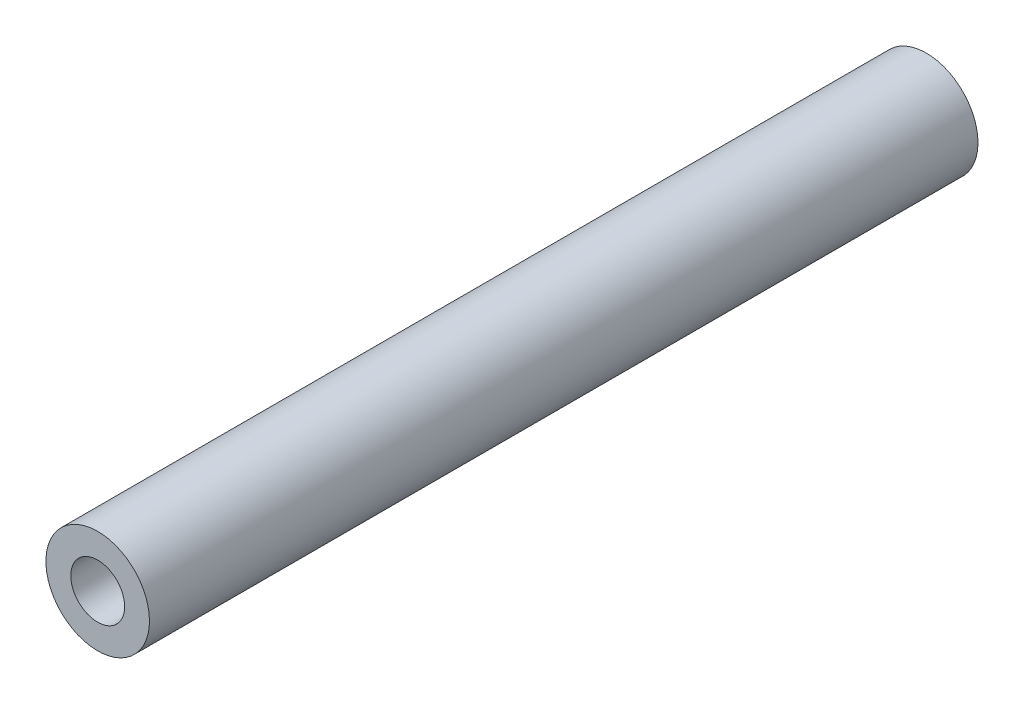
ISO-10303-21;
HEADER;
FILE_DESCRIPTION(('STEP AP214'),'2;1');
FILE_NAME('part.step','',(''),(''),'','','');
FILE_SCHEMA(('AUTOMOTIVE_DESIGN { 1 0 10303 214 1 1 1 1 }'));
ENDSEC;
DATA;
#1=APPLICATION_CONTEXT('core data for automotive mechanical design processes');
#2=APPLICATION_PROTOCOL_DEFINITION('international standard','automotive_design',2000,#1);
#3=PRODUCT_CONTEXT('',#1,'mechanical');
#4=PRODUCT('Part','Part','',(#3));
#5=PRODUCT_RELATED_PRODUCT_CATEGORY('part','',(#4));
#6=PRODUCT_DEFINITION_FORMATION('','',#4);
#7=PRODUCT_DEFINITION_CONTEXT('part definition',#1,'design');
#8=PRODUCT_DEFINITION('design','',#6,#7);
#9=PRODUCT_DEFINITION_SHAPE('','',#8);
#10=(LENGTH_UNIT() NAMED_UNIT(*) SI_UNIT(.MILLI.,.METRE.));
#11=(NAMED_UNIT(*) PLANE_ANGLE_UNIT() SI_UNIT($,.RADIAN.));
#12=(NAMED_UNIT(*) SI_UNIT($,.STERADIAN.) SOLID_ANGLE_UNIT());
#13=UNCERTAINTY_MEASURE_WITH_UNIT(LENGTH_MEASURE(1.E-05),#10,'distance_accuracy_value','');
#14=(GEOMETRIC_REPRESENTATION_CONTEXT(3) GLOBAL_UNCERTAINTY_ASSIGNED_CONTEXT((#13)) GLOBAL_UNIT_ASSIGNED_CONTEXT((#10,
#11,#12)) REPRESENTATION_CONTEXT('',''));
#15=CARTESIAN_POINT('',(0.,0.,0.));
#16=DIRECTION('',(0.,0.,1.));
#17=DIRECTION('',(1.,0.,0.));
#18=AXIS2_PLACEMENT_3D('',#15,#16,#17);
#19=CARTESIAN_POINT('',(0.,0.,50.8));
#20=DIRECTION('',(0.,0.,1.));
#21=DIRECTION('',(1.,0.,0.));
#22=AXIS2_PLACEMENT_3D('',#19,#20,#21);
#23=PLANE('',#22);
#24=CARTESIAN_POINT('',(0.,0.,50.8));
#25=DIRECTION('',(0.,0.,1.));
#26=DIRECTION('',(1.,0.,0.));
#27=AXIS2_PLACEMENT_3D('',#24,#25,#26);
#28=CIRCLE('',#27,6.35);
#29=CARTESIAN_POINT('',(6.35,0.,50.8));
#30=VERTEX_POINT('',#29);
#31=EDGE_CURVE('E12',#30,#30,#28,.T.);
#32=ORIENTED_EDGE('',*,*,#31,.T.);
#33=EDGE_LOOP('',(#32));
#34=FACE_BOUND('',#33,.T.);
#35=CARTESIAN_POINT('',(0.,0.,50.8));
#36=DIRECTION('',(0.,0.,1.));
#37=DIRECTION('',(1.,0.,0.));
#38=AXIS2_PLACEMENT_3D('',#35,#36,#37);
#39=CIRCLE('',#38,3.302);
#40=CARTESIAN_POINT('',(3.302,0.,50.8));
#41=VERTEX_POINT('',#40);
#42=EDGE_CURVE('E51',#41,#41,#39,.T.);
#43=ORIENTED_EDGE('',*,*,#42,.F.);
#44=EDGE_LOOP('',(#43));
#45=FACE_BOUND('',#44,.T.);
#46=ADVANCED_FACE('F44',(#34,#45),#23,.T.);
#47=CARTESIAN_POINT('',(0.,0.,50.8));
#48=DIRECTION('',(0.,0.,-1.));
#49=DIRECTION('',(-1.,0.,0.));
#50=AXIS2_PLACEMENT_3D('',#47,#48,#49);
#51=CYLINDRICAL_SURFACE('',#50,6.35);
#52=ORIENTED_EDGE('',*,*,#31,.F.);
#53=EDGE_LOOP('',(#52));
#54=FACE_BOUND('',#53,.T.);
#55=CARTESIAN_POINT('',(0.,0.,-50.8));
#56=DIRECTION('',(0.,0.,1.));
#57=DIRECTION('',(1.,0.,0.));
#58=AXIS2_PLACEMENT_3D('',#55,#56,#57);
#59=CIRCLE('',#58,6.35);
#60=CARTESIAN_POINT('',(6.35,0.,-50.8));
#61=VERTEX_POINT('',#60);
#62=EDGE_CURVE('E55',#61,#61,#59,.T.);
#63=ORIENTED_EDGE('',*,*,#62,.T.);
#64=EDGE_LOOP('',(#63));
#65=FACE_BOUND('',#64,.T.);
#66=ADVANCED_FACE('F46',(#54,#65),#51,.T.);
#67=CARTESIAN_POINT('',(0.,0.,50.8));
#68=DIRECTION('',(0.,0.,-1.));
#69=DIRECTION('',(-1.,0.,0.));
#70=AXIS2_PLACEMENT_3D('',#67,#68,#69);
#71=CYLINDRICAL_SURFACE('',#70,3.302);
#72=ORIENTED_EDGE('',*,*,#42,.T.);
#73=EDGE_LOOP('',(#72));
#74=FACE_BOUND('',#73,.T.);
#75=CARTESIAN_POINT('',(0.,0.,-50.8));
#76=DIRECTION('',(0.,0.,1.));
#77=DIRECTION('',(1.,0.,0.));
#78=AXIS2_PLACEMENT_3D('',#75,#76,#77);
#79=CIRCLE('',#78,3.302);
#80=CARTESIAN_POINT('',(3.302,0.,-50.8));
#81=VERTEX_POINT('',#80);
#82=EDGE_CURVE('E59',#81,#81,#79,.T.);
#83=ORIENTED_EDGE('',*,*,#82,.F.);
#84=EDGE_LOOP('',(#83));
#85=FACE_BOUND('',#84,.T.);
#86=ADVANCED_FACE('F68',(#74,#85),#71,.F.);
#87=CARTESIAN_POINT('',(0.,0.,-50.8));
#88=DIRECTION('',(0.,0.,1.));
#89=DIRECTION('',(1.,0.,0.));
#90=AXIS2_PLACEMENT_3D('',#87,#88,#89);
#91=PLANE('',#90);
#92=ORIENTED_EDGE('',*,*,#82,.T.);
#93=EDGE_LOOP('',(#92));
#94=FACE_BOUND('',#93,.T.);
#95=ORIENTED_EDGE('',*,*,#62,.F.);
#96=EDGE_LOOP('',(#95));
#97=FACE_BOUND('',#96,.T.);
#98=ADVANCED_FACE('F65',(#94,#97),#91,.F.);
#99=CLOSED_SHELL('',(#46,#66,#86,#98));
#100=MANIFOLD_SOLID_BREP('B2',#99);
#101=ADVANCED_BREP_SHAPE_REPRESENTATION('',(#18,#100),#14);
#102=SHAPE_DEFINITION_REPRESENTATION(#9,#101);
ENDSEC;
END-ISO-10303-21;
